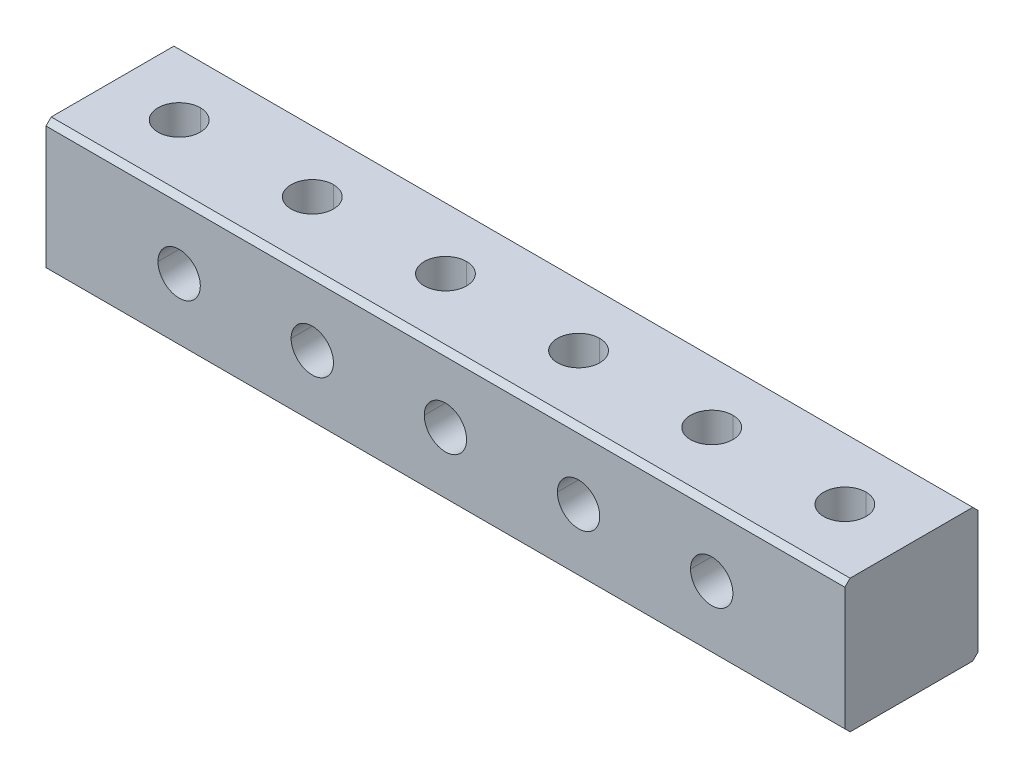
ISO-10303-21;
HEADER;
FILE_DESCRIPTION(('STEP AP214'),'2;1');
FILE_NAME('part.step','',(''),(''),'','','');
FILE_SCHEMA(('AUTOMOTIVE_DESIGN { 1 0 10303 214 1 1 1 1 }'));
ENDSEC;
DATA;
#1=APPLICATION_CONTEXT('core data for automotive mechanical design processes');
#2=APPLICATION_PROTOCOL_DEFINITION('international standard','automotive_design',2000,#1);
#3=PRODUCT_CONTEXT('',#1,'mechanical');
#4=PRODUCT('Part','Part','',(#3));
#5=PRODUCT_RELATED_PRODUCT_CATEGORY('part','',(#4));
#6=PRODUCT_DEFINITION_FORMATION('','',#4);
#7=PRODUCT_DEFINITION_CONTEXT('part definition',#1,'design');
#8=PRODUCT_DEFINITION('design','',#6,#7);
#9=PRODUCT_DEFINITION_SHAPE('','',#8);
#10=(LENGTH_UNIT() NAMED_UNIT(*) SI_UNIT(.MILLI.,.METRE.));
#11=(NAMED_UNIT(*) PLANE_ANGLE_UNIT() SI_UNIT($,.RADIAN.));
#12=(NAMED_UNIT(*) SI_UNIT($,.STERADIAN.) SOLID_ANGLE_UNIT());
#13=UNCERTAINTY_MEASURE_WITH_UNIT(LENGTH_MEASURE(1.E-05),#10,'distance_accuracy_value','');
#14=(GEOMETRIC_REPRESENTATION_CONTEXT(3) GLOBAL_UNCERTAINTY_ASSIGNED_CONTEXT((#13)) GLOBAL_UNIT_ASSIGNED_CONTEXT((#10,
#11,#12)) REPRESENTATION_CONTEXT('',''));
#15=CARTESIAN_POINT('',(0.,0.,0.));
#16=DIRECTION('',(0.,0.,1.));
#17=DIRECTION('',(1.,0.,0.));
#18=AXIS2_PLACEMENT_3D('',#15,#16,#17);
#19=CARTESIAN_POINT('',(38.1,5.85,6.35));
#20=DIRECTION('',(0.,-0.707106781186548,-0.707106781186548));
#21=DIRECTION('',(0.,-0.707106781186548,0.707106781186548));
#22=AXIS2_PLACEMENT_3D('',#19,#20,#21);
#23=PLANE('',#22);
#24=DIRECTION('',(0.,-0.707106781186548,0.707106781186548));
#25=VECTOR('',#24,1.);
#26=CARTESIAN_POINT('',(38.1,6.1,6.1));
#27=LINE('',#26,#25);
#28=CARTESIAN_POINT('',(38.1,6.35,5.85));
#29=VERTEX_POINT('',#28);
#30=CARTESIAN_POINT('',(38.1,5.85,6.35));
#31=VERTEX_POINT('',#30);
#32=EDGE_CURVE('E546',#29,#31,#27,.T.);
#33=ORIENTED_EDGE('',*,*,#32,.F.);
#34=DIRECTION('',(1.,0.,0.));
#35=VECTOR('',#34,1.);
#36=CARTESIAN_POINT('',(38.1,6.35,5.85));
#37=LINE('',#36,#35);
#38=CARTESIAN_POINT('',(-38.1,6.35,5.85));
#39=VERTEX_POINT('',#38);
#40=EDGE_CURVE('E341',#39,#29,#37,.T.);
#41=ORIENTED_EDGE('',*,*,#40,.F.);
#42=DIRECTION('',(0.,0.707106781186548,-0.707106781186548));
#43=VECTOR('',#42,1.);
#44=CARTESIAN_POINT('',(-38.1,5.85,6.35));
#45=LINE('',#44,#43);
#46=CARTESIAN_POINT('',(-38.1,5.85,6.35));
#47=VERTEX_POINT('',#46);
#48=EDGE_CURVE('E20',#47,#39,#45,.T.);
#49=ORIENTED_EDGE('',*,*,#48,.F.);
#50=DIRECTION('',(-1.,0.,0.));
#51=VECTOR('',#50,1.);
#52=CARTESIAN_POINT('',(38.1,5.85,6.35));
#53=LINE('',#52,#51);
#54=EDGE_CURVE('E405',#31,#47,#53,.T.);
#55=ORIENTED_EDGE('',*,*,#54,.F.);
#56=EDGE_LOOP('',(#33,#41,#49,#55));
#57=FACE_BOUND('',#56,.T.);
#58=ADVANCED_FACE('F17',(#57),#23,.F.);
#59=CARTESIAN_POINT('',(38.1,6.35,-5.85));
#60=DIRECTION('',(0.,-0.707106781186548,0.707106781186548));
#61=DIRECTION('',(-1.,0.,0.));
#62=AXIS2_PLACEMENT_3D('',#59,#60,#61);
#63=PLANE('',#62);
#64=DIRECTION('',(0.,0.707106781186548,0.707106781186548));
#65=VECTOR('',#64,1.);
#66=CARTESIAN_POINT('',(38.1,6.1,-6.1));
#67=LINE('',#66,#65);
#68=CARTESIAN_POINT('',(38.1,5.85,-6.35));
#69=VERTEX_POINT('',#68);
#70=CARTESIAN_POINT('',(38.1,6.35,-5.85));
#71=VERTEX_POINT('',#70);
#72=EDGE_CURVE('E470',#69,#71,#67,.T.);
#73=ORIENTED_EDGE('',*,*,#72,.F.);
#74=DIRECTION('',(1.,0.,0.));
#75=VECTOR('',#74,1.);
#76=CARTESIAN_POINT('',(38.1,5.85,-6.35));
#77=LINE('',#76,#75);
#78=CARTESIAN_POINT('',(-38.1,5.85,-6.35));
#79=VERTEX_POINT('',#78);
#80=EDGE_CURVE('E382',#79,#69,#77,.T.);
#81=ORIENTED_EDGE('',*,*,#80,.F.);
#82=DIRECTION('',(0.,-0.707106781186548,-0.707106781186548));
#83=VECTOR('',#82,1.);
#84=CARTESIAN_POINT('',(-38.1,6.35,-5.85));
#85=LINE('',#84,#83);
#86=CARTESIAN_POINT('',(-38.1,6.35,-5.85));
#87=VERTEX_POINT('',#86);
#88=EDGE_CURVE('E11',#87,#79,#85,.T.);
#89=ORIENTED_EDGE('',*,*,#88,.F.);
#90=DIRECTION('',(-1.,0.,0.));
#91=VECTOR('',#90,1.);
#92=CARTESIAN_POINT('',(38.1,6.35,-5.85));
#93=LINE('',#92,#91);
#94=EDGE_CURVE('E505',#71,#87,#93,.T.);
#95=ORIENTED_EDGE('',*,*,#94,.F.);
#96=EDGE_LOOP('',(#73,#81,#89,#95));
#97=FACE_BOUND('',#96,.T.);
#98=ADVANCED_FACE('F567',(#97),#63,.F.);
#99=CARTESIAN_POINT('',(38.1,-6.35,5.85));
#100=DIRECTION('',(0.,0.707106781186548,-0.707106781186548));
#101=DIRECTION('',(-1.,0.,0.));
#102=AXIS2_PLACEMENT_3D('',#99,#100,#101);
#103=PLANE('',#102);
#104=DIRECTION('',(0.,-0.707106781186548,-0.707106781186548));
#105=VECTOR('',#104,1.);
#106=CARTESIAN_POINT('',(38.1,-6.1,6.1));
#107=LINE('',#106,#105);
#108=CARTESIAN_POINT('',(38.1,-5.85,6.35));
#109=VERTEX_POINT('',#108);
#110=CARTESIAN_POINT('',(38.1,-6.35,5.85));
#111=VERTEX_POINT('',#110);
#112=EDGE_CURVE('E40',#109,#111,#107,.T.);
#113=ORIENTED_EDGE('',*,*,#112,.F.);
#114=DIRECTION('',(1.,0.,0.));
#115=VECTOR('',#114,1.);
#116=CARTESIAN_POINT('',(38.1,-5.85,6.35));
#117=LINE('',#116,#115);
#118=CARTESIAN_POINT('',(-38.1,-5.85,6.35));
#119=VERTEX_POINT('',#118);
#120=EDGE_CURVE('E374',#119,#109,#117,.T.);
#121=ORIENTED_EDGE('',*,*,#120,.F.);
#122=DIRECTION('',(0.,0.707106781186548,0.707106781186548));
#123=VECTOR('',#122,1.);
#124=CARTESIAN_POINT('',(-38.1,-6.35,5.85));
#125=LINE('',#124,#123);
#126=CARTESIAN_POINT('',(-38.1,-6.35,5.85));
#127=VERTEX_POINT('',#126);
#128=EDGE_CURVE('E237',#127,#119,#125,.T.);
#129=ORIENTED_EDGE('',*,*,#128,.F.);
#130=DIRECTION('',(-1.,0.,0.));
#131=VECTOR('',#130,1.);
#132=CARTESIAN_POINT('',(38.1,-6.35,5.85));
#133=LINE('',#132,#131);
#134=EDGE_CURVE('E250',#111,#127,#133,.T.);
#135=ORIENTED_EDGE('',*,*,#134,.F.);
#136=EDGE_LOOP('',(#113,#121,#129,#135));
#137=FACE_BOUND('',#136,.T.);
#138=ADVANCED_FACE('F577',(#137),#103,.F.);
#139=CARTESIAN_POINT('',(38.1,-5.85,-6.35));
#140=DIRECTION('',(0.,0.707106781186548,0.707106781186548));
#141=DIRECTION('',(1.,0.,0.));
#142=AXIS2_PLACEMENT_3D('',#139,#140,#141);
#143=PLANE('',#142);
#144=DIRECTION('',(0.,0.707106781186548,-0.707106781186548));
#145=VECTOR('',#144,1.);
#146=CARTESIAN_POINT('',(38.1,-6.1,-6.1));
#147=LINE('',#146,#145);
#148=CARTESIAN_POINT('',(38.1,-6.35,-5.85));
#149=VERTEX_POINT('',#148);
#150=CARTESIAN_POINT('',(38.1,-5.85,-6.35));
#151=VERTEX_POINT('',#150);
#152=EDGE_CURVE('E242',#149,#151,#147,.T.);
#153=ORIENTED_EDGE('',*,*,#152,.F.);
#154=DIRECTION('',(1.,0.,0.));
#155=VECTOR('',#154,1.);
#156=CARTESIAN_POINT('',(38.1,-6.35,-5.85));
#157=LINE('',#156,#155);
#158=CARTESIAN_POINT('',(-38.1,-6.35,-5.85));
#159=VERTEX_POINT('',#158);
#160=EDGE_CURVE('E240',#159,#149,#157,.T.);
#161=ORIENTED_EDGE('',*,*,#160,.F.);
#162=DIRECTION('',(0.,-0.707106781186548,0.707106781186548));
#163=VECTOR('',#162,1.);
#164=CARTESIAN_POINT('',(-38.1,-5.85,-6.35));
#165=LINE('',#164,#163);
#166=CARTESIAN_POINT('',(-38.1,-5.85,-6.35));
#167=VERTEX_POINT('',#166);
#168=EDGE_CURVE('E226',#167,#159,#165,.T.);
#169=ORIENTED_EDGE('',*,*,#168,.F.);
#170=DIRECTION('',(-1.,0.,0.));
#171=VECTOR('',#170,1.);
#172=CARTESIAN_POINT('',(38.1,-5.85,-6.35));
#173=LINE('',#172,#171);
#174=EDGE_CURVE('E487',#151,#167,#173,.T.);
#175=ORIENTED_EDGE('',*,*,#174,.F.);
#176=EDGE_LOOP('',(#153,#161,#169,#175));
#177=FACE_BOUND('',#176,.T.);
#178=ADVANCED_FACE('F241',(#177),#143,.F.);
#179=CARTESIAN_POINT('',(-31.75,6.35,0.));
#180=DIRECTION('',(0.,1.,0.));
#181=DIRECTION('',(0.,0.,1.));
#182=AXIS2_PLACEMENT_3D('',#179,#180,#181);
#183=CYLINDRICAL_SURFACE('',#182,2.0193);
#184=DIRECTION('',(0.,1.,0.));
#185=VECTOR('',#184,1.);
#186=CARTESIAN_POINT('',(-31.75,6.35,-2.0193));
#187=LINE('',#186,#185);
#188=CARTESIAN_POINT('',(-31.75,-6.35,-2.0193));
#189=VERTEX_POINT('',#188);
#190=CARTESIAN_POINT('',(-31.75,6.35,-2.0193));
#191=VERTEX_POINT('',#190);
#192=EDGE_CURVE('E262',#189,#191,#187,.T.);
#193=ORIENTED_EDGE('',*,*,#192,.F.);
#194=CARTESIAN_POINT('',(-31.75,-6.35,0.));
#195=DIRECTION('',(0.,1.,0.));
#196=DIRECTION('',(0.,0.,1.));
#197=AXIS2_PLACEMENT_3D('',#194,#195,#196);
#198=CIRCLE('',#197,2.0193);
#199=CARTESIAN_POINT('',(-31.75,-6.35,2.0193));
#200=VERTEX_POINT('',#199);
#201=EDGE_CURVE('E332',#200,#189,#198,.T.);
#202=ORIENTED_EDGE('',*,*,#201,.F.);
#203=DIRECTION('',(0.,1.,0.));
#204=VECTOR('',#203,1.);
#205=CARTESIAN_POINT('',(-31.75,6.35,2.0193));
#206=LINE('',#205,#204);
#207=CARTESIAN_POINT('',(-31.75,6.35,2.0193));
#208=VERTEX_POINT('',#207);
#209=EDGE_CURVE('E264',#200,#208,#206,.T.);
#210=ORIENTED_EDGE('',*,*,#209,.T.);
#211=CARTESIAN_POINT('',(-31.75,6.35,0.));
#212=DIRECTION('',(0.,1.,0.));
#213=DIRECTION('',(0.,0.,1.));
#214=AXIS2_PLACEMENT_3D('',#211,#212,#213);
#215=CIRCLE('',#214,2.0193);
#216=EDGE_CURVE('E336',#208,#191,#215,.T.);
#217=ORIENTED_EDGE('',*,*,#216,.T.);
#218=EDGE_LOOP('',(#193,#202,#210,#217));
#219=FACE_BOUND('',#218,.T.);
#220=ADVANCED_FACE('F586',(#219),#183,.F.);
#221=CARTESIAN_POINT('',(-19.05,6.35,0.));
#222=DIRECTION('',(0.,1.,0.));
#223=DIRECTION('',(0.,0.,1.));
#224=AXIS2_PLACEMENT_3D('',#221,#222,#223);
#225=CYLINDRICAL_SURFACE('',#224,2.0193);
#226=DIRECTION('',(0.,1.,0.));
#227=VECTOR('',#226,1.);
#228=CARTESIAN_POINT('',(-19.05,6.35,-2.0193));
#229=LINE('',#228,#227);
#230=CARTESIAN_POINT('',(-19.05,-6.35,-2.0193));
#231=VERTEX_POINT('',#230);
#232=CARTESIAN_POINT('',(-19.05,6.35,-2.0193));
#233=VERTEX_POINT('',#232);
#234=EDGE_CURVE('E276',#231,#233,#229,.T.);
#235=ORIENTED_EDGE('',*,*,#234,.F.);
#236=CARTESIAN_POINT('',(-19.05,-6.35,0.));
#237=DIRECTION('',(0.,1.,0.));
#238=DIRECTION('',(0.,0.,1.));
#239=AXIS2_PLACEMENT_3D('',#236,#237,#238);
#240=CIRCLE('',#239,2.0193);
#241=CARTESIAN_POINT('',(-19.05,-6.35,2.0193));
#242=VERTEX_POINT('',#241);
#243=EDGE_CURVE('E327',#242,#231,#240,.T.);
#244=ORIENTED_EDGE('',*,*,#243,.F.);
#245=DIRECTION('',(0.,1.,0.));
#246=VECTOR('',#245,1.);
#247=CARTESIAN_POINT('',(-19.05,6.35,2.0193));
#248=LINE('',#247,#246);
#249=CARTESIAN_POINT('',(-19.05,6.35,2.0193));
#250=VERTEX_POINT('',#249);
#251=EDGE_CURVE('E301',#242,#250,#248,.T.);
#252=ORIENTED_EDGE('',*,*,#251,.T.);
#253=CARTESIAN_POINT('',(-19.05,6.35,0.));
#254=DIRECTION('',(0.,1.,0.));
#255=DIRECTION('',(0.,0.,1.));
#256=AXIS2_PLACEMENT_3D('',#253,#254,#255);
#257=CIRCLE('',#256,2.0193);
#258=EDGE_CURVE('E340',#250,#233,#257,.T.);
#259=ORIENTED_EDGE('',*,*,#258,.T.);
#260=EDGE_LOOP('',(#235,#244,#252,#259));
#261=FACE_BOUND('',#260,.T.);
#262=ADVANCED_FACE('F631',(#261),#225,.F.);
#263=CARTESIAN_POINT('',(31.75,6.35,0.));
#264=DIRECTION('',(0.,1.,0.));
#265=DIRECTION('',(0.,0.,1.));
#266=AXIS2_PLACEMENT_3D('',#263,#264,#265);
#267=CYLINDRICAL_SURFACE('',#266,2.0193);
#268=DIRECTION('',(0.,1.,0.));
#269=VECTOR('',#268,1.);
#270=CARTESIAN_POINT('',(31.75,6.35,-2.0193));
#271=LINE('',#270,#269);
#272=CARTESIAN_POINT('',(31.75,-6.35,-2.0193));
#273=VERTEX_POINT('',#272);
#274=CARTESIAN_POINT('',(31.75,6.35,-2.0193));
#275=VERTEX_POINT('',#274);
#276=EDGE_CURVE('E292',#273,#275,#271,.T.);
#277=ORIENTED_EDGE('',*,*,#276,.F.);
#278=CARTESIAN_POINT('',(31.75,-6.35,0.));
#279=DIRECTION('',(0.,1.,0.));
#280=DIRECTION('',(0.,0.,1.));
#281=AXIS2_PLACEMENT_3D('',#278,#279,#280);
#282=CIRCLE('',#281,2.0193);
#283=CARTESIAN_POINT('',(31.75,-6.35,2.0193));
#284=VERTEX_POINT('',#283);
#285=EDGE_CURVE('E331',#284,#273,#282,.T.);
#286=ORIENTED_EDGE('',*,*,#285,.F.);
#287=DIRECTION('',(0.,1.,0.));
#288=VECTOR('',#287,1.);
#289=CARTESIAN_POINT('',(31.75,6.35,2.0193));
#290=LINE('',#289,#288);
#291=CARTESIAN_POINT('',(31.75,6.35,2.0193));
#292=VERTEX_POINT('',#291);
#293=EDGE_CURVE('E319',#284,#292,#290,.T.);
#294=ORIENTED_EDGE('',*,*,#293,.T.);
#295=CARTESIAN_POINT('',(31.75,6.35,0.));
#296=DIRECTION('',(0.,1.,0.));
#297=DIRECTION('',(0.,0.,1.));
#298=AXIS2_PLACEMENT_3D('',#295,#296,#297);
#299=CIRCLE('',#298,2.0193);
#300=EDGE_CURVE('E483',#292,#275,#299,.T.);
#301=ORIENTED_EDGE('',*,*,#300,.T.);
#302=EDGE_LOOP('',(#277,#286,#294,#301));
#303=FACE_BOUND('',#302,.T.);
#304=ADVANCED_FACE('F641',(#303),#267,.F.);
#305=CARTESIAN_POINT('',(19.05,6.35,0.));
#306=DIRECTION('',(0.,1.,0.));
#307=DIRECTION('',(0.,0.,1.));
#308=AXIS2_PLACEMENT_3D('',#305,#306,#307);
#309=CYLINDRICAL_SURFACE('',#308,2.0193);
#310=DIRECTION('',(0.,1.,0.));
#311=VECTOR('',#310,1.);
#312=CARTESIAN_POINT('',(19.05,6.35,-2.0193));
#313=LINE('',#312,#311);
#314=CARTESIAN_POINT('',(19.05,-6.35,-2.0193));
#315=VERTEX_POINT('',#314);
#316=CARTESIAN_POINT('',(19.05,6.35,-2.0193));
#317=VERTEX_POINT('',#316);
#318=EDGE_CURVE('E315',#315,#317,#313,.T.);
#319=ORIENTED_EDGE('',*,*,#318,.F.);
#320=CARTESIAN_POINT('',(19.05,-6.35,0.));
#321=DIRECTION('',(0.,1.,0.));
#322=DIRECTION('',(0.,0.,1.));
#323=AXIS2_PLACEMENT_3D('',#320,#321,#322);
#324=CIRCLE('',#323,2.0193);
#325=CARTESIAN_POINT('',(19.05,-6.35,2.0193));
#326=VERTEX_POINT('',#325);
#327=EDGE_CURVE('E441',#326,#315,#324,.T.);
#328=ORIENTED_EDGE('',*,*,#327,.F.);
#329=DIRECTION('',(0.,1.,0.));
#330=VECTOR('',#329,1.);
#331=CARTESIAN_POINT('',(19.05,6.35,2.0193));
#332=LINE('',#331,#330);
#333=CARTESIAN_POINT('',(19.05,6.35,2.0193));
#334=VERTEX_POINT('',#333);
#335=EDGE_CURVE('E314',#326,#334,#332,.T.);
#336=ORIENTED_EDGE('',*,*,#335,.T.);
#337=CARTESIAN_POINT('',(19.05,6.35,0.));
#338=DIRECTION('',(0.,1.,0.));
#339=DIRECTION('',(0.,0.,1.));
#340=AXIS2_PLACEMENT_3D('',#337,#338,#339);
#341=CIRCLE('',#340,2.0193);
#342=EDGE_CURVE('E514',#334,#317,#341,.T.);
#343=ORIENTED_EDGE('',*,*,#342,.T.);
#344=EDGE_LOOP('',(#319,#328,#336,#343));
#345=FACE_BOUND('',#344,.T.);
#346=ADVANCED_FACE('F652',(#345),#309,.F.);
#347=CARTESIAN_POINT('',(6.35,6.35,0.));
#348=DIRECTION('',(0.,1.,0.));
#349=DIRECTION('',(0.,0.,1.));
#350=AXIS2_PLACEMENT_3D('',#347,#348,#349);
#351=CYLINDRICAL_SURFACE('',#350,2.0193);
#352=DIRECTION('',(0.,1.,0.));
#353=VECTOR('',#352,1.);
#354=CARTESIAN_POINT('',(6.35,6.35,-2.0193));
#355=LINE('',#354,#353);
#356=CARTESIAN_POINT('',(6.35,-6.35,-2.0193));
#357=VERTEX_POINT('',#356);
#358=CARTESIAN_POINT('',(6.35,6.35,-2.0193));
#359=VERTEX_POINT('',#358);
#360=EDGE_CURVE('E357',#357,#359,#355,.T.);
#361=ORIENTED_EDGE('',*,*,#360,.F.);
#362=CARTESIAN_POINT('',(6.35,-6.35,0.));
#363=DIRECTION('',(0.,1.,0.));
#364=DIRECTION('',(0.,0.,1.));
#365=AXIS2_PLACEMENT_3D('',#362,#363,#364);
#366=CIRCLE('',#365,2.0193);
#367=CARTESIAN_POINT('',(6.35,-6.35,2.0193));
#368=VERTEX_POINT('',#367);
#369=EDGE_CURVE('E539',#368,#357,#366,.T.);
#370=ORIENTED_EDGE('',*,*,#369,.F.);
#371=DIRECTION('',(0.,1.,0.));
#372=VECTOR('',#371,1.);
#373=CARTESIAN_POINT('',(6.35,6.35,2.0193));
#374=LINE('',#373,#372);
#375=CARTESIAN_POINT('',(6.35,6.35,2.0193));
#376=VERTEX_POINT('',#375);
#377=EDGE_CURVE('E365',#368,#376,#374,.T.);
#378=ORIENTED_EDGE('',*,*,#377,.T.);
#379=CARTESIAN_POINT('',(6.35,6.35,0.));
#380=DIRECTION('',(0.,1.,0.));
#381=DIRECTION('',(0.,0.,1.));
#382=AXIS2_PLACEMENT_3D('',#379,#380,#381);
#383=CIRCLE('',#382,2.0193);
#384=EDGE_CURVE('E518',#376,#359,#383,.T.);
#385=ORIENTED_EDGE('',*,*,#384,.T.);
#386=EDGE_LOOP('',(#361,#370,#378,#385));
#387=FACE_BOUND('',#386,.T.);
#388=ADVANCED_FACE('F663',(#387),#351,.F.);
#389=CARTESIAN_POINT('',(-25.4,0.,6.35));
#390=DIRECTION('',(0.,0.,1.));
#391=DIRECTION('',(1.,0.,0.));
#392=AXIS2_PLACEMENT_3D('',#389,#390,#391);
#393=CYLINDRICAL_SURFACE('',#392,2.0193);
#394=DIRECTION('',(0.,0.,1.));
#395=VECTOR('',#394,1.);
#396=CARTESIAN_POINT('',(-27.4193,0.,6.35));
#397=LINE('',#396,#395);
#398=CARTESIAN_POINT('',(-27.4193,0.,-6.35));
#399=VERTEX_POINT('',#398);
#400=CARTESIAN_POINT('',(-27.4193,0.,6.35));
#401=VERTEX_POINT('',#400);
#402=EDGE_CURVE('E373',#399,#401,#397,.T.);
#403=ORIENTED_EDGE('',*,*,#402,.F.);
#404=CARTESIAN_POINT('',(-25.4,0.,-6.35));
#405=DIRECTION('',(0.,0.,1.));
#406=DIRECTION('',(1.,0.,0.));
#407=AXIS2_PLACEMENT_3D('',#404,#405,#406);
#408=CIRCLE('',#407,2.0193);
#409=CARTESIAN_POINT('',(-23.3807,0.,-6.35));
#410=VERTEX_POINT('',#409);
#411=EDGE_CURVE('E291',#410,#399,#408,.T.);
#412=ORIENTED_EDGE('',*,*,#411,.F.);
#413=DIRECTION('',(0.,0.,1.));
#414=VECTOR('',#413,1.);
#415=CARTESIAN_POINT('',(-23.3807,0.,6.35));
#416=LINE('',#415,#414);
#417=CARTESIAN_POINT('',(-23.3807,0.,6.35));
#418=VERTEX_POINT('',#417);
#419=EDGE_CURVE('E390',#410,#418,#416,.T.);
#420=ORIENTED_EDGE('',*,*,#419,.T.);
#421=CARTESIAN_POINT('',(-25.4,0.,6.35));
#422=DIRECTION('',(0.,0.,1.));
#423=DIRECTION('',(1.,0.,0.));
#424=AXIS2_PLACEMENT_3D('',#421,#422,#423);
#425=CIRCLE('',#424,2.0193);
#426=EDGE_CURVE('E309',#418,#401,#425,.T.);
#427=ORIENTED_EDGE('',*,*,#426,.T.);
#428=EDGE_LOOP('',(#403,#412,#420,#427));
#429=FACE_BOUND('',#428,.T.);
#430=ADVANCED_FACE('F674',(#429),#393,.F.);
#431=CARTESIAN_POINT('',(-12.7,0.,6.35));
#432=DIRECTION('',(0.,0.,1.));
#433=DIRECTION('',(1.,0.,0.));
#434=AXIS2_PLACEMENT_3D('',#431,#432,#433);
#435=CYLINDRICAL_SURFACE('',#434,2.0193);
#436=DIRECTION('',(0.,0.,1.));
#437=VECTOR('',#436,1.);
#438=CARTESIAN_POINT('',(-14.7193,0.,6.35));
#439=LINE('',#438,#437);
#440=CARTESIAN_POINT('',(-14.7193,0.,-6.35));
#441=VERTEX_POINT('',#440);
#442=CARTESIAN_POINT('',(-14.7193,0.,6.35));
#443=VERTEX_POINT('',#442);
#444=EDGE_CURVE('E398',#441,#443,#439,.T.);
#445=ORIENTED_EDGE('',*,*,#444,.F.);
#446=CARTESIAN_POINT('',(-12.7,0.,-6.35));
#447=DIRECTION('',(0.,0.,1.));
#448=DIRECTION('',(1.,0.,0.));
#449=AXIS2_PLACEMENT_3D('',#446,#447,#448);
#450=CIRCLE('',#449,2.0193);
#451=CARTESIAN_POINT('',(-10.6807,0.,-6.35));
#452=VERTEX_POINT('',#451);
#453=EDGE_CURVE('E287',#452,#441,#450,.T.);
#454=ORIENTED_EDGE('',*,*,#453,.F.);
#455=DIRECTION('',(0.,0.,1.));
#456=VECTOR('',#455,1.);
#457=CARTESIAN_POINT('',(-10.6807,0.,6.35));
#458=LINE('',#457,#456);
#459=CARTESIAN_POINT('',(-10.6807,0.,6.35));
#460=VERTEX_POINT('',#459);
#461=EDGE_CURVE('E409',#452,#460,#458,.T.);
#462=ORIENTED_EDGE('',*,*,#461,.T.);
#463=CARTESIAN_POINT('',(-12.7,0.,6.35));
#464=DIRECTION('',(0.,0.,1.));
#465=DIRECTION('',(1.,0.,0.));
#466=AXIS2_PLACEMENT_3D('',#463,#464,#465);
#467=CIRCLE('',#466,2.0193);
#468=EDGE_CURVE('E305',#460,#443,#467,.T.);
#469=ORIENTED_EDGE('',*,*,#468,.T.);
#470=EDGE_LOOP('',(#445,#454,#462,#469));
#471=FACE_BOUND('',#470,.T.);
#472=ADVANCED_FACE('F682',(#471),#435,.F.);
#473=CARTESIAN_POINT('',(25.4,0.,6.35));
#474=DIRECTION('',(0.,0.,1.));
#475=DIRECTION('',(1.,0.,0.));
#476=AXIS2_PLACEMENT_3D('',#473,#474,#475);
#477=CYLINDRICAL_SURFACE('',#476,2.0193);
#478=DIRECTION('',(0.,0.,1.));
#479=VECTOR('',#478,1.);
#480=CARTESIAN_POINT('',(23.3807,0.,6.35));
#481=LINE('',#480,#479);
#482=CARTESIAN_POINT('',(23.3807,0.,-6.35));
#483=VERTEX_POINT('',#482);
#484=CARTESIAN_POINT('',(23.3807,0.,6.35));
#485=VERTEX_POINT('',#484);
#486=EDGE_CURVE('E417',#483,#485,#481,.T.);
#487=ORIENTED_EDGE('',*,*,#486,.F.);
#488=CARTESIAN_POINT('',(25.4,0.,-6.35));
#489=DIRECTION('',(0.,0.,1.));
#490=DIRECTION('',(1.,0.,0.));
#491=AXIS2_PLACEMENT_3D('',#488,#489,#490);
#492=CIRCLE('',#491,2.0193);
#493=CARTESIAN_POINT('',(27.4193,0.,-6.35));
#494=VERTEX_POINT('',#493);
#495=EDGE_CURVE('E290',#494,#483,#492,.T.);
#496=ORIENTED_EDGE('',*,*,#495,.F.);
#497=DIRECTION('',(0.,0.,1.));
#498=VECTOR('',#497,1.);
#499=CARTESIAN_POINT('',(27.4193,0.,6.35));
#500=LINE('',#499,#498);
#501=CARTESIAN_POINT('',(27.4193,0.,6.35));
#502=VERTEX_POINT('',#501);
#503=EDGE_CURVE('E345',#494,#502,#500,.T.);
#504=ORIENTED_EDGE('',*,*,#503,.T.);
#505=CARTESIAN_POINT('',(25.4,0.,6.35));
#506=DIRECTION('',(0.,0.,1.));
#507=DIRECTION('',(1.,0.,0.));
#508=AXIS2_PLACEMENT_3D('',#505,#506,#507);
#509=CIRCLE('',#508,2.0193);
#510=EDGE_CURVE('E308',#502,#485,#509,.T.);
#511=ORIENTED_EDGE('',*,*,#510,.T.);
#512=EDGE_LOOP('',(#487,#496,#504,#511));
#513=FACE_BOUND('',#512,.T.);
#514=ADVANCED_FACE('F687',(#513),#477,.F.);
#515=CARTESIAN_POINT('',(12.7,0.,6.35));
#516=DIRECTION('',(0.,0.,1.));
#517=DIRECTION('',(1.,0.,0.));
#518=AXIS2_PLACEMENT_3D('',#515,#516,#517);
#519=CYLINDRICAL_SURFACE('',#518,2.0193);
#520=DIRECTION('',(0.,0.,1.));
#521=VECTOR('',#520,1.);
#522=CARTESIAN_POINT('',(10.6807,0.,6.35));
#523=LINE('',#522,#521);
#524=CARTESIAN_POINT('',(10.6807,0.,-6.35));
#525=VERTEX_POINT('',#524);
#526=CARTESIAN_POINT('',(10.6807,0.,6.35));
#527=VERTEX_POINT('',#526);
#528=EDGE_CURVE('E277',#525,#527,#523,.T.);
#529=ORIENTED_EDGE('',*,*,#528,.F.);
#530=CARTESIAN_POINT('',(12.7,0.,-6.35));
#531=DIRECTION('',(0.,0.,1.));
#532=DIRECTION('',(1.,0.,0.));
#533=AXIS2_PLACEMENT_3D('',#530,#531,#532);
#534=CIRCLE('',#533,2.0193);
#535=CARTESIAN_POINT('',(14.7193,0.,-6.35));
#536=VERTEX_POINT('',#535);
#537=EDGE_CURVE('E496',#536,#525,#534,.T.);
#538=ORIENTED_EDGE('',*,*,#537,.F.);
#539=DIRECTION('',(0.,0.,1.));
#540=VECTOR('',#539,1.);
#541=CARTESIAN_POINT('',(14.7193,0.,6.35));
#542=LINE('',#541,#540);
#543=CARTESIAN_POINT('',(14.7193,0.,6.35));
#544=VERTEX_POINT('',#543);
#545=EDGE_CURVE('E353',#536,#544,#542,.T.);
#546=ORIENTED_EDGE('',*,*,#545,.T.);
#547=CARTESIAN_POINT('',(12.7,0.,6.35));
#548=DIRECTION('',(0.,0.,1.));
#549=DIRECTION('',(1.,0.,0.));
#550=AXIS2_PLACEMENT_3D('',#547,#548,#549);
#551=CIRCLE('',#550,2.0193);
#552=EDGE_CURVE('E258',#544,#527,#551,.T.);
#553=ORIENTED_EDGE('',*,*,#552,.T.);
#554=EDGE_LOOP('',(#529,#538,#546,#553));
#555=FACE_BOUND('',#554,.T.);
#556=ADVANCED_FACE('F698',(#555),#519,.F.);
#557=CARTESIAN_POINT('',(-6.35,6.35,0.));
#558=DIRECTION('',(0.,1.,0.));
#559=DIRECTION('',(0.,0.,1.));
#560=AXIS2_PLACEMENT_3D('',#557,#558,#559);
#561=CYLINDRICAL_SURFACE('',#560,2.0193);
#562=DIRECTION('',(0.,1.,0.));
#563=VECTOR('',#562,1.);
#564=CARTESIAN_POINT('',(-6.35,6.35,-2.0193));
#565=LINE('',#564,#563);
#566=CARTESIAN_POINT('',(-6.35,-6.35,-2.0193));
#567=VERTEX_POINT('',#566);
#568=CARTESIAN_POINT('',(-6.35,6.35,-2.0193));
#569=VERTEX_POINT('',#568);
#570=EDGE_CURVE('E447',#567,#569,#565,.T.);
#571=ORIENTED_EDGE('',*,*,#570,.F.);
#572=CARTESIAN_POINT('',(-6.35,-6.35,0.));
#573=DIRECTION('',(0.,1.,0.));
#574=DIRECTION('',(0.,0.,1.));
#575=AXIS2_PLACEMENT_3D('',#572,#573,#574);
#576=CIRCLE('',#575,2.0193);
#577=CARTESIAN_POINT('',(-6.35,-6.35,2.0193));
#578=VERTEX_POINT('',#577);
#579=EDGE_CURVE('E471',#578,#567,#576,.T.);
#580=ORIENTED_EDGE('',*,*,#579,.F.);
#581=DIRECTION('',(0.,1.,0.));
#582=VECTOR('',#581,1.);
#583=CARTESIAN_POINT('',(-6.35,6.35,2.0193));
#584=LINE('',#583,#582);
#585=CARTESIAN_POINT('',(-6.35,6.35,2.0193));
#586=VERTEX_POINT('',#585);
#587=EDGE_CURVE('E455',#578,#586,#584,.T.);
#588=ORIENTED_EDGE('',*,*,#587,.T.);
#589=CARTESIAN_POINT('',(-6.35,6.35,0.));
#590=DIRECTION('',(0.,1.,0.));
#591=DIRECTION('',(0.,0.,1.));
#592=AXIS2_PLACEMENT_3D('',#589,#590,#591);
#593=CIRCLE('',#592,2.0193);
#594=EDGE_CURVE('E521',#586,#569,#593,.T.);
#595=ORIENTED_EDGE('',*,*,#594,.T.);
#596=EDGE_LOOP('',(#571,#580,#588,#595));
#597=FACE_BOUND('',#596,.T.);
#598=ADVANCED_FACE('F709',(#597),#561,.F.);
#599=CARTESIAN_POINT('',(0.,0.,6.35));
#600=DIRECTION('',(0.,0.,1.));
#601=DIRECTION('',(1.,0.,0.));
#602=AXIS2_PLACEMENT_3D('',#599,#600,#601);
#603=CYLINDRICAL_SURFACE('',#602,2.0193);
#604=DIRECTION('',(0.,0.,1.));
#605=VECTOR('',#604,1.);
#606=CARTESIAN_POINT('',(-2.0193,0.,6.35));
#607=LINE('',#606,#605);
#608=CARTESIAN_POINT('',(-2.0193,0.,-6.35));
#609=VERTEX_POINT('',#608);
#610=CARTESIAN_POINT('',(-2.0193,0.,6.35));
#611=VERTEX_POINT('',#610);
#612=EDGE_CURVE('E463',#609,#611,#607,.T.);
#613=ORIENTED_EDGE('',*,*,#612,.F.);
#614=CARTESIAN_POINT('',(0.,0.,-6.35));
#615=DIRECTION('',(0.,0.,1.));
#616=DIRECTION('',(1.,0.,0.));
#617=AXIS2_PLACEMENT_3D('',#614,#615,#616);
#618=CIRCLE('',#617,2.0193);
#619=CARTESIAN_POINT('',(2.0193,0.,-6.35));
#620=VERTEX_POINT('',#619);
#621=EDGE_CURVE('E492',#620,#609,#618,.T.);
#622=ORIENTED_EDGE('',*,*,#621,.F.);
#623=DIRECTION('',(0.,0.,1.));
#624=VECTOR('',#623,1.);
#625=CARTESIAN_POINT('',(2.0193,0.,6.35));
#626=LINE('',#625,#624);
#627=CARTESIAN_POINT('',(2.0193,0.,6.35));
#628=VERTEX_POINT('',#627);
#629=EDGE_CURVE('E475',#620,#628,#626,.T.);
#630=ORIENTED_EDGE('',*,*,#629,.T.);
#631=CARTESIAN_POINT('',(0.,0.,6.35));
#632=DIRECTION('',(0.,0.,1.));
#633=DIRECTION('',(1.,0.,0.));
#634=AXIS2_PLACEMENT_3D('',#631,#632,#633);
#635=CIRCLE('',#634,2.0193);
#636=EDGE_CURVE('E252',#628,#611,#635,.T.);
#637=ORIENTED_EDGE('',*,*,#636,.T.);
#638=EDGE_LOOP('',(#613,#622,#630,#637));
#639=FACE_BOUND('',#638,.T.);
#640=ADVANCED_FACE('F720',(#639),#603,.F.);
#641=CARTESIAN_POINT('',(-38.1,0.,0.));
#642=DIRECTION('',(1.,0.,0.));
#643=DIRECTION('',(0.,1.,0.));
#644=AXIS2_PLACEMENT_3D('',#641,#642,#643);
#645=PLANE('',#644);
#646=DIRECTION('',(0.,1.,0.));
#647=VECTOR('',#646,1.);
#648=CARTESIAN_POINT('',(-38.1,6.35,-6.35));
#649=LINE('',#648,#647);
#650=EDGE_CURVE('E232',#167,#79,#649,.T.);
#651=ORIENTED_EDGE('',*,*,#650,.F.);
#652=ORIENTED_EDGE('',*,*,#168,.T.);
#653=DIRECTION('',(0.,0.,-1.));
#654=VECTOR('',#653,1.);
#655=CARTESIAN_POINT('',(-38.1,-6.35,6.35));
#656=LINE('',#655,#654);
#657=EDGE_CURVE('E230',#127,#159,#656,.T.);
#658=ORIENTED_EDGE('',*,*,#657,.F.);
#659=ORIENTED_EDGE('',*,*,#128,.T.);
#660=DIRECTION('',(0.,-1.,0.));
#661=VECTOR('',#660,1.);
#662=CARTESIAN_POINT('',(-38.1,6.35,6.35));
#663=LINE('',#662,#661);
#664=EDGE_CURVE('E379',#47,#119,#663,.T.);
#665=ORIENTED_EDGE('',*,*,#664,.F.);
#666=ORIENTED_EDGE('',*,*,#48,.T.);
#667=DIRECTION('',(0.,0.,1.));
#668=VECTOR('',#667,1.);
#669=CARTESIAN_POINT('',(-38.1,6.35,6.35));
#670=LINE('',#669,#668);
#671=EDGE_CURVE('E427',#87,#39,#670,.T.);
#672=ORIENTED_EDGE('',*,*,#671,.F.);
#673=ORIENTED_EDGE('',*,*,#88,.T.);
#674=EDGE_LOOP('',(#651,#652,#658,#659,#665,#666,#672,#673));
#675=FACE_BOUND('',#674,.T.);
#676=ADVANCED_FACE('F228',(#675),#645,.F.);
#677=CARTESIAN_POINT('',(38.1,0.,0.));
#678=DIRECTION('',(1.,0.,0.));
#679=DIRECTION('',(0.,1.,0.));
#680=AXIS2_PLACEMENT_3D('',#677,#678,#679);
#681=PLANE('',#680);
#682=DIRECTION('',(0.,0.,-1.));
#683=VECTOR('',#682,1.);
#684=CARTESIAN_POINT('',(38.1,-6.35,6.35));
#685=LINE('',#684,#683);
#686=EDGE_CURVE('E246',#111,#149,#685,.T.);
#687=ORIENTED_EDGE('',*,*,#686,.T.);
#688=ORIENTED_EDGE('',*,*,#152,.T.);
#689=DIRECTION('',(0.,1.,0.));
#690=VECTOR('',#689,1.);
#691=CARTESIAN_POINT('',(38.1,6.35,-6.35));
#692=LINE('',#691,#690);
#693=EDGE_CURVE('E479',#151,#69,#692,.T.);
#694=ORIENTED_EDGE('',*,*,#693,.T.);
#695=ORIENTED_EDGE('',*,*,#72,.T.);
#696=DIRECTION('',(0.,0.,1.));
#697=VECTOR('',#696,1.);
#698=CARTESIAN_POINT('',(38.1,6.35,6.35));
#699=LINE('',#698,#697);
#700=EDGE_CURVE('E495',#71,#29,#699,.T.);
#701=ORIENTED_EDGE('',*,*,#700,.T.);
#702=ORIENTED_EDGE('',*,*,#32,.T.);
#703=DIRECTION('',(0.,-1.,0.));
#704=VECTOR('',#703,1.);
#705=CARTESIAN_POINT('',(38.1,6.35,6.35));
#706=LINE('',#705,#704);
#707=EDGE_CURVE('E378',#31,#109,#706,.T.);
#708=ORIENTED_EDGE('',*,*,#707,.T.);
#709=ORIENTED_EDGE('',*,*,#112,.T.);
#710=EDGE_LOOP('',(#687,#688,#694,#695,#701,#702,#708,#709));
#711=FACE_BOUND('',#710,.T.);
#712=ADVANCED_FACE('F572',(#711),#681,.T.);
#713=CARTESIAN_POINT('',(38.1,-6.35,6.35));
#714=DIRECTION('',(0.,1.,0.));
#715=DIRECTION('',(1.,0.,0.));
#716=AXIS2_PLACEMENT_3D('',#713,#714,#715);
#717=PLANE('',#716);
#718=ORIENTED_EDGE('',*,*,#579,.T.);
#719=CARTESIAN_POINT('',(-6.35,-6.35,0.));
#720=DIRECTION('',(0.,1.,0.));
#721=DIRECTION('',(0.,0.,1.));
#722=AXIS2_PLACEMENT_3D('',#719,#720,#721);
#723=CIRCLE('',#722,2.0193);
#724=EDGE_CURVE('E437',#567,#578,#723,.T.);
#725=ORIENTED_EDGE('',*,*,#724,.T.);
#726=EDGE_LOOP('',(#718,#725));
#727=FACE_BOUND('',#726,.T.);
#728=ORIENTED_EDGE('',*,*,#369,.T.);
#729=CARTESIAN_POINT('',(6.35,-6.35,0.));
#730=DIRECTION('',(0.,1.,0.));
#731=DIRECTION('',(0.,0.,1.));
#732=AXIS2_PLACEMENT_3D('',#729,#730,#731);
#733=CIRCLE('',#732,2.0193);
#734=EDGE_CURVE('E349',#357,#368,#733,.T.);
#735=ORIENTED_EDGE('',*,*,#734,.T.);
#736=EDGE_LOOP('',(#728,#735));
#737=FACE_BOUND('',#736,.T.);
#738=ORIENTED_EDGE('',*,*,#327,.T.);
#739=CARTESIAN_POINT('',(19.05,-6.35,0.));
#740=DIRECTION('',(0.,1.,0.));
#741=DIRECTION('',(0.,0.,1.));
#742=AXIS2_PLACEMENT_3D('',#739,#740,#741);
#743=CIRCLE('',#742,2.0193);
#744=EDGE_CURVE('E323',#315,#326,#743,.T.);
#745=ORIENTED_EDGE('',*,*,#744,.T.);
#746=EDGE_LOOP('',(#738,#745));
#747=FACE_BOUND('',#746,.T.);
#748=ORIENTED_EDGE('',*,*,#285,.T.);
#749=CARTESIAN_POINT('',(31.75,-6.35,0.));
#750=DIRECTION('',(0.,1.,0.));
#751=DIRECTION('',(0.,0.,1.));
#752=AXIS2_PLACEMENT_3D('',#749,#750,#751);
#753=CIRCLE('',#752,2.0193);
#754=EDGE_CURVE('E297',#273,#284,#753,.T.);
#755=ORIENTED_EDGE('',*,*,#754,.T.);
#756=EDGE_LOOP('',(#748,#755));
#757=FACE_BOUND('',#756,.T.);
#758=ORIENTED_EDGE('',*,*,#243,.T.);
#759=CARTESIAN_POINT('',(-19.05,-6.35,0.));
#760=DIRECTION('',(0.,1.,0.));
#761=DIRECTION('',(0.,0.,1.));
#762=AXIS2_PLACEMENT_3D('',#759,#760,#761);
#763=CIRCLE('',#762,2.0193);
#764=EDGE_CURVE('E268',#231,#242,#763,.T.);
#765=ORIENTED_EDGE('',*,*,#764,.T.);
#766=EDGE_LOOP('',(#758,#765));
#767=FACE_BOUND('',#766,.T.);
#768=ORIENTED_EDGE('',*,*,#201,.T.);
#769=CARTESIAN_POINT('',(-31.75,-6.35,0.));
#770=DIRECTION('',(0.,1.,0.));
#771=DIRECTION('',(0.,0.,1.));
#772=AXIS2_PLACEMENT_3D('',#769,#770,#771);
#773=CIRCLE('',#772,2.0193);
#774=EDGE_CURVE('E1382',#189,#200,#773,.T.);
#775=ORIENTED_EDGE('',*,*,#774,.T.);
#776=EDGE_LOOP('',(#768,#775));
#777=FACE_BOUND('',#776,.T.);
#778=ORIENTED_EDGE('',*,*,#657,.T.);
#779=ORIENTED_EDGE('',*,*,#160,.T.);
#780=ORIENTED_EDGE('',*,*,#686,.F.);
#781=ORIENTED_EDGE('',*,*,#134,.T.);
#782=EDGE_LOOP('',(#778,#779,#780,#781));
#783=FACE_BOUND('',#782,.T.);
#784=ADVANCED_FACE('F249',(#727,#737,#747,#757,#767,#777,#783),#717,.F.);
#785=CARTESIAN_POINT('',(38.1,6.35,6.35));
#786=DIRECTION('',(0.,0.,-1.));
#787=DIRECTION('',(-1.,0.,0.));
#788=AXIS2_PLACEMENT_3D('',#785,#786,#787);
#789=PLANE('',#788);
#790=ORIENTED_EDGE('',*,*,#636,.F.);
#791=CARTESIAN_POINT('',(0.,0.,6.35));
#792=DIRECTION('',(0.,0.,1.));
#793=DIRECTION('',(1.,0.,0.));
#794=AXIS2_PLACEMENT_3D('',#791,#792,#793);
#795=CIRCLE('',#794,2.0193);
#796=EDGE_CURVE('E467',#611,#628,#795,.T.);
#797=ORIENTED_EDGE('',*,*,#796,.F.);
#798=EDGE_LOOP('',(#790,#797));
#799=FACE_BOUND('',#798,.T.);
#800=ORIENTED_EDGE('',*,*,#552,.F.);
#801=CARTESIAN_POINT('',(12.7,0.,6.35));
#802=DIRECTION('',(0.,0.,1.));
#803=DIRECTION('',(1.,0.,0.));
#804=AXIS2_PLACEMENT_3D('',#801,#802,#803);
#805=CIRCLE('',#804,2.0193);
#806=EDGE_CURVE('E281',#527,#544,#805,.T.);
#807=ORIENTED_EDGE('',*,*,#806,.F.);
#808=EDGE_LOOP('',(#800,#807));
#809=FACE_BOUND('',#808,.T.);
#810=ORIENTED_EDGE('',*,*,#510,.F.);
#811=CARTESIAN_POINT('',(25.4,0.,6.35));
#812=DIRECTION('',(0.,0.,1.));
#813=DIRECTION('',(1.,0.,0.));
#814=AXIS2_PLACEMENT_3D('',#811,#812,#813);
#815=CIRCLE('',#814,2.0193);
#816=EDGE_CURVE('E423',#485,#502,#815,.T.);
#817=ORIENTED_EDGE('',*,*,#816,.F.);
#818=EDGE_LOOP('',(#810,#817));
#819=FACE_BOUND('',#818,.T.);
#820=ORIENTED_EDGE('',*,*,#468,.F.);
#821=CARTESIAN_POINT('',(-12.7,0.,6.35));
#822=DIRECTION('',(0.,0.,1.));
#823=DIRECTION('',(1.,0.,0.));
#824=AXIS2_PLACEMENT_3D('',#821,#822,#823);
#825=CIRCLE('',#824,2.0193);
#826=EDGE_CURVE('E402',#443,#460,#825,.T.);
#827=ORIENTED_EDGE('',*,*,#826,.F.);
#828=EDGE_LOOP('',(#820,#827));
#829=FACE_BOUND('',#828,.T.);
#830=ORIENTED_EDGE('',*,*,#426,.F.);
#831=CARTESIAN_POINT('',(-25.4,0.,6.35));
#832=DIRECTION('',(0.,0.,1.));
#833=DIRECTION('',(1.,0.,0.));
#834=AXIS2_PLACEMENT_3D('',#831,#832,#833);
#835=CIRCLE('',#834,2.0193);
#836=EDGE_CURVE('E386',#401,#418,#835,.T.);
#837=ORIENTED_EDGE('',*,*,#836,.F.);
#838=EDGE_LOOP('',(#830,#837));
#839=FACE_BOUND('',#838,.T.);
#840=ORIENTED_EDGE('',*,*,#664,.T.);
#841=ORIENTED_EDGE('',*,*,#120,.T.);
#842=ORIENTED_EDGE('',*,*,#707,.F.);
#843=ORIENTED_EDGE('',*,*,#54,.T.);
#844=EDGE_LOOP('',(#840,#841,#842,#843));
#845=FACE_BOUND('',#844,.T.);
#846=ADVANCED_FACE('F575',(#799,#809,#819,#829,#839,#845),#789,.F.);
#847=CARTESIAN_POINT('',(38.1,6.35,6.35));
#848=DIRECTION('',(0.,-1.,0.));
#849=DIRECTION('',(0.,0.,-1.));
#850=AXIS2_PLACEMENT_3D('',#847,#848,#849);
#851=PLANE('',#850);
#852=ORIENTED_EDGE('',*,*,#594,.F.);
#853=CARTESIAN_POINT('',(-6.35,6.35,0.));
#854=DIRECTION('',(0.,1.,0.));
#855=DIRECTION('',(0.,0.,1.));
#856=AXIS2_PLACEMENT_3D('',#853,#854,#855);
#857=CIRCLE('',#856,2.0193);
#858=EDGE_CURVE('E451',#569,#586,#857,.T.);
#859=ORIENTED_EDGE('',*,*,#858,.F.);
#860=EDGE_LOOP('',(#852,#859));
#861=FACE_BOUND('',#860,.T.);
#862=ORIENTED_EDGE('',*,*,#384,.F.);
#863=CARTESIAN_POINT('',(6.35,6.35,0.));
#864=DIRECTION('',(0.,1.,0.));
#865=DIRECTION('',(0.,0.,1.));
#866=AXIS2_PLACEMENT_3D('',#863,#864,#865);
#867=CIRCLE('',#866,2.0193);
#868=EDGE_CURVE('E361',#359,#376,#867,.T.);
#869=ORIENTED_EDGE('',*,*,#868,.F.);
#870=EDGE_LOOP('',(#862,#869));
#871=FACE_BOUND('',#870,.T.);
#872=ORIENTED_EDGE('',*,*,#342,.F.);
#873=CARTESIAN_POINT('',(19.05,6.35,0.));
#874=DIRECTION('',(0.,1.,0.));
#875=DIRECTION('',(0.,0.,1.));
#876=AXIS2_PLACEMENT_3D('',#873,#874,#875);
#877=CIRCLE('',#876,2.0193);
#878=EDGE_CURVE('E310',#317,#334,#877,.T.);
#879=ORIENTED_EDGE('',*,*,#878,.F.);
#880=EDGE_LOOP('',(#872,#879));
#881=FACE_BOUND('',#880,.T.);
#882=ORIENTED_EDGE('',*,*,#300,.F.);
#883=CARTESIAN_POINT('',(31.75,6.35,0.));
#884=DIRECTION('',(0.,1.,0.));
#885=DIRECTION('',(0.,0.,1.));
#886=AXIS2_PLACEMENT_3D('',#883,#884,#885);
#887=CIRCLE('',#886,2.0193);
#888=EDGE_CURVE('E296',#275,#292,#887,.T.);
#889=ORIENTED_EDGE('',*,*,#888,.F.);
#890=EDGE_LOOP('',(#882,#889));
#891=FACE_BOUND('',#890,.T.);
#892=ORIENTED_EDGE('',*,*,#258,.F.);
#893=CARTESIAN_POINT('',(-19.05,6.35,0.));
#894=DIRECTION('',(0.,1.,0.));
#895=DIRECTION('',(0.,0.,1.));
#896=AXIS2_PLACEMENT_3D('',#893,#894,#895);
#897=CIRCLE('',#896,2.0193);
#898=EDGE_CURVE('E286',#233,#250,#897,.T.);
#899=ORIENTED_EDGE('',*,*,#898,.F.);
#900=EDGE_LOOP('',(#892,#899));
#901=FACE_BOUND('',#900,.T.);
#902=ORIENTED_EDGE('',*,*,#216,.F.);
#903=CARTESIAN_POINT('',(-31.75,6.35,0.));
#904=DIRECTION('',(0.,1.,0.));
#905=DIRECTION('',(0.,0.,1.));
#906=AXIS2_PLACEMENT_3D('',#903,#904,#905);
#907=CIRCLE('',#906,2.0193);
#908=EDGE_CURVE('E269',#191,#208,#907,.T.);
#909=ORIENTED_EDGE('',*,*,#908,.F.);
#910=EDGE_LOOP('',(#902,#909));
#911=FACE_BOUND('',#910,.T.);
#912=ORIENTED_EDGE('',*,*,#700,.F.);
#913=ORIENTED_EDGE('',*,*,#94,.T.);
#914=ORIENTED_EDGE('',*,*,#671,.T.);
#915=ORIENTED_EDGE('',*,*,#40,.T.);
#916=EDGE_LOOP('',(#912,#913,#914,#915));
#917=FACE_BOUND('',#916,.T.);
#918=ADVANCED_FACE('F564',(#861,#871,#881,#891,#901,#911,#917),#851,.F.);
#919=CARTESIAN_POINT('',(38.1,6.35,-6.35));
#920=DIRECTION('',(0.,0.,1.));
#921=DIRECTION('',(0.,-1.,0.));
#922=AXIS2_PLACEMENT_3D('',#919,#920,#921);
#923=PLANE('',#922);
#924=ORIENTED_EDGE('',*,*,#621,.T.);
#925=CARTESIAN_POINT('',(0.,0.,-6.35));
#926=DIRECTION('',(0.,0.,1.));
#927=DIRECTION('',(1.,0.,0.));
#928=AXIS2_PLACEMENT_3D('',#925,#926,#927);
#929=CIRCLE('',#928,2.0193);
#930=EDGE_CURVE('E459',#609,#620,#929,.T.);
#931=ORIENTED_EDGE('',*,*,#930,.T.);
#932=EDGE_LOOP('',(#924,#931));
#933=FACE_BOUND('',#932,.T.);
#934=ORIENTED_EDGE('',*,*,#537,.T.);
#935=CARTESIAN_POINT('',(12.7,0.,-6.35));
#936=DIRECTION('',(0.,0.,1.));
#937=DIRECTION('',(1.,0.,0.));
#938=AXIS2_PLACEMENT_3D('',#935,#936,#937);
#939=CIRCLE('',#938,2.0193);
#940=EDGE_CURVE('E282',#525,#536,#939,.T.);
#941=ORIENTED_EDGE('',*,*,#940,.T.);
#942=EDGE_LOOP('',(#934,#941));
#943=FACE_BOUND('',#942,.T.);
#944=ORIENTED_EDGE('',*,*,#495,.T.);
#945=CARTESIAN_POINT('',(25.4,0.,-6.35));
#946=DIRECTION('',(0.,0.,1.));
#947=DIRECTION('',(1.,0.,0.));
#948=AXIS2_PLACEMENT_3D('',#945,#946,#947);
#949=CIRCLE('',#948,2.0193);
#950=EDGE_CURVE('E413',#483,#494,#949,.T.);
#951=ORIENTED_EDGE('',*,*,#950,.T.);
#952=EDGE_LOOP('',(#944,#951));
#953=FACE_BOUND('',#952,.T.);
#954=ORIENTED_EDGE('',*,*,#453,.T.);
#955=CARTESIAN_POINT('',(-12.7,0.,-6.35));
#956=DIRECTION('',(0.,0.,1.));
#957=DIRECTION('',(1.,0.,0.));
#958=AXIS2_PLACEMENT_3D('',#955,#956,#957);
#959=CIRCLE('',#958,2.0193);
#960=EDGE_CURVE('E394',#441,#452,#959,.T.);
#961=ORIENTED_EDGE('',*,*,#960,.T.);
#962=EDGE_LOOP('',(#954,#961));
#963=FACE_BOUND('',#962,.T.);
#964=ORIENTED_EDGE('',*,*,#411,.T.);
#965=CARTESIAN_POINT('',(-25.4,0.,-6.35));
#966=DIRECTION('',(0.,0.,1.));
#967=DIRECTION('',(1.,0.,0.));
#968=AXIS2_PLACEMENT_3D('',#965,#966,#967);
#969=CIRCLE('',#968,2.0193);
#970=EDGE_CURVE('E369',#399,#410,#969,.T.);
#971=ORIENTED_EDGE('',*,*,#970,.T.);
#972=EDGE_LOOP('',(#964,#971));
#973=FACE_BOUND('',#972,.T.);
#974=ORIENTED_EDGE('',*,*,#693,.F.);
#975=ORIENTED_EDGE('',*,*,#174,.T.);
#976=ORIENTED_EDGE('',*,*,#650,.T.);
#977=ORIENTED_EDGE('',*,*,#80,.T.);
#978=EDGE_LOOP('',(#974,#975,#976,#977));
#979=FACE_BOUND('',#978,.T.);
#980=ADVANCED_FACE('F571',(#933,#943,#953,#963,#973,#979),#923,.F.);
#981=CARTESIAN_POINT('',(0.,0.,6.35));
#982=DIRECTION('',(0.,0.,1.));
#983=DIRECTION('',(1.,0.,0.));
#984=AXIS2_PLACEMENT_3D('',#981,#982,#983);
#985=CYLINDRICAL_SURFACE('',#984,2.0193);
#986=ORIENTED_EDGE('',*,*,#930,.F.);
#987=ORIENTED_EDGE('',*,*,#612,.T.);
#988=ORIENTED_EDGE('',*,*,#796,.T.);
#989=ORIENTED_EDGE('',*,*,#629,.F.);
#990=EDGE_LOOP('',(#986,#987,#988,#989));
#991=FACE_BOUND('',#990,.T.);
#992=ADVANCED_FACE('F762',(#991),#985,.F.);
#993=CARTESIAN_POINT('',(-6.35,6.35,0.));
#994=DIRECTION('',(0.,1.,0.));
#995=DIRECTION('',(0.,0.,1.));
#996=AXIS2_PLACEMENT_3D('',#993,#994,#995);
#997=CYLINDRICAL_SURFACE('',#996,2.0193);
#998=ORIENTED_EDGE('',*,*,#724,.F.);
#999=ORIENTED_EDGE('',*,*,#570,.T.);
#1000=ORIENTED_EDGE('',*,*,#858,.T.);
#1001=ORIENTED_EDGE('',*,*,#587,.F.);
#1002=EDGE_LOOP('',(#998,#999,#1000,#1001));
#1003=FACE_BOUND('',#1002,.T.);
#1004=ADVANCED_FACE('F774',(#1003),#997,.F.);
#1005=CARTESIAN_POINT('',(12.7,0.,6.35));
#1006=DIRECTION('',(0.,0.,1.));
#1007=DIRECTION('',(1.,0.,0.));
#1008=AXIS2_PLACEMENT_3D('',#1005,#1006,#1007);
#1009=CYLINDRICAL_SURFACE('',#1008,2.0193);
#1010=ORIENTED_EDGE('',*,*,#940,.F.);
#1011=ORIENTED_EDGE('',*,*,#528,.T.);
#1012=ORIENTED_EDGE('',*,*,#806,.T.);
#1013=ORIENTED_EDGE('',*,*,#545,.F.);
#1014=EDGE_LOOP('',(#1010,#1011,#1012,#1013));
#1015=FACE_BOUND('',#1014,.T.);
#1016=ADVANCED_FACE('F785',(#1015),#1009,.F.);
#1017=CARTESIAN_POINT('',(25.4,0.,6.35));
#1018=DIRECTION('',(0.,0.,1.));
#1019=DIRECTION('',(1.,0.,0.));
#1020=AXIS2_PLACEMENT_3D('',#1017,#1018,#1019);
#1021=CYLINDRICAL_SURFACE('',#1020,2.0193);
#1022=ORIENTED_EDGE('',*,*,#950,.F.);
#1023=ORIENTED_EDGE('',*,*,#486,.T.);
#1024=ORIENTED_EDGE('',*,*,#816,.T.);
#1025=ORIENTED_EDGE('',*,*,#503,.F.);
#1026=EDGE_LOOP('',(#1022,#1023,#1024,#1025));
#1027=FACE_BOUND('',#1026,.T.);
#1028=ADVANCED_FACE('F802',(#1027),#1021,.F.);
#1029=CARTESIAN_POINT('',(-12.7,0.,6.35));
#1030=DIRECTION('',(0.,0.,1.));
#1031=DIRECTION('',(1.,0.,0.));
#1032=AXIS2_PLACEMENT_3D('',#1029,#1030,#1031);
#1033=CYLINDRICAL_SURFACE('',#1032,2.0193);
#1034=ORIENTED_EDGE('',*,*,#960,.F.);
#1035=ORIENTED_EDGE('',*,*,#444,.T.);
#1036=ORIENTED_EDGE('',*,*,#826,.T.);
#1037=ORIENTED_EDGE('',*,*,#461,.F.);
#1038=EDGE_LOOP('',(#1034,#1035,#1036,#1037));
#1039=FACE_BOUND('',#1038,.T.);
#1040=ADVANCED_FACE('F807',(#1039),#1033,.F.);
#1041=CARTESIAN_POINT('',(-25.4,0.,6.35));
#1042=DIRECTION('',(0.,0.,1.));
#1043=DIRECTION('',(1.,0.,0.));
#1044=AXIS2_PLACEMENT_3D('',#1041,#1042,#1043);
#1045=CYLINDRICAL_SURFACE('',#1044,2.0193);
#1046=ORIENTED_EDGE('',*,*,#970,.F.);
#1047=ORIENTED_EDGE('',*,*,#402,.T.);
#1048=ORIENTED_EDGE('',*,*,#836,.T.);
#1049=ORIENTED_EDGE('',*,*,#419,.F.);
#1050=EDGE_LOOP('',(#1046,#1047,#1048,#1049));
#1051=FACE_BOUND('',#1050,.T.);
#1052=ADVANCED_FACE('F817',(#1051),#1045,.F.);
#1053=CARTESIAN_POINT('',(6.35,6.35,0.));
#1054=DIRECTION('',(0.,1.,0.));
#1055=DIRECTION('',(0.,0.,1.));
#1056=AXIS2_PLACEMENT_3D('',#1053,#1054,#1055);
#1057=CYLINDRICAL_SURFACE('',#1056,2.0193);
#1058=ORIENTED_EDGE('',*,*,#734,.F.);
#1059=ORIENTED_EDGE('',*,*,#360,.T.);
#1060=ORIENTED_EDGE('',*,*,#868,.T.);
#1061=ORIENTED_EDGE('',*,*,#377,.F.);
#1062=EDGE_LOOP('',(#1058,#1059,#1060,#1061));
#1063=FACE_BOUND('',#1062,.T.);
#1064=ADVANCED_FACE('F844',(#1063),#1057,.F.);
#1065=CARTESIAN_POINT('',(19.05,6.35,0.));
#1066=DIRECTION('',(0.,1.,0.));
#1067=DIRECTION('',(0.,0.,1.));
#1068=AXIS2_PLACEMENT_3D('',#1065,#1066,#1067);
#1069=CYLINDRICAL_SURFACE('',#1068,2.0193);
#1070=ORIENTED_EDGE('',*,*,#744,.F.);
#1071=ORIENTED_EDGE('',*,*,#318,.T.);
#1072=ORIENTED_EDGE('',*,*,#878,.T.);
#1073=ORIENTED_EDGE('',*,*,#335,.F.);
#1074=EDGE_LOOP('',(#1070,#1071,#1072,#1073));
#1075=FACE_BOUND('',#1074,.T.);
#1076=ADVANCED_FACE('F853',(#1075),#1069,.F.);
#1077=CARTESIAN_POINT('',(31.75,6.35,0.));
#1078=DIRECTION('',(0.,1.,0.));
#1079=DIRECTION('',(0.,0.,1.));
#1080=AXIS2_PLACEMENT_3D('',#1077,#1078,#1079);
#1081=CYLINDRICAL_SURFACE('',#1080,2.0193);
#1082=ORIENTED_EDGE('',*,*,#754,.F.);
#1083=ORIENTED_EDGE('',*,*,#276,.T.);
#1084=ORIENTED_EDGE('',*,*,#888,.T.);
#1085=ORIENTED_EDGE('',*,*,#293,.F.);
#1086=EDGE_LOOP('',(#1082,#1083,#1084,#1085));
#1087=FACE_BOUND('',#1086,.T.);
#1088=ADVANCED_FACE('F862',(#1087),#1081,.F.);
#1089=CARTESIAN_POINT('',(-19.05,6.35,0.));
#1090=DIRECTION('',(0.,1.,0.));
#1091=DIRECTION('',(0.,0.,1.));
#1092=AXIS2_PLACEMENT_3D('',#1089,#1090,#1091);
#1093=CYLINDRICAL_SURFACE('',#1092,2.0193);
#1094=ORIENTED_EDGE('',*,*,#764,.F.);
#1095=ORIENTED_EDGE('',*,*,#234,.T.);
#1096=ORIENTED_EDGE('',*,*,#898,.T.);
#1097=ORIENTED_EDGE('',*,*,#251,.F.);
#1098=EDGE_LOOP('',(#1094,#1095,#1096,#1097));
#1099=FACE_BOUND('',#1098,.T.);
#1100=ADVANCED_FACE('F871',(#1099),#1093,.F.);
#1101=CARTESIAN_POINT('',(-31.75,6.35,0.));
#1102=DIRECTION('',(0.,1.,0.));
#1103=DIRECTION('',(0.,0.,1.));
#1104=AXIS2_PLACEMENT_3D('',#1101,#1102,#1103);
#1105=CYLINDRICAL_SURFACE('',#1104,2.0193);
#1106=ORIENTED_EDGE('',*,*,#774,.F.);
#1107=ORIENTED_EDGE('',*,*,#192,.T.);
#1108=ORIENTED_EDGE('',*,*,#908,.T.);
#1109=ORIENTED_EDGE('',*,*,#209,.F.);
#1110=EDGE_LOOP('',(#1106,#1107,#1108,#1109));
#1111=FACE_BOUND('',#1110,.T.);
#1112=ADVANCED_FACE('F880',(#1111),#1105,.F.);
#1113=CLOSED_SHELL('',(#58,#98,#138,#178,#220,#262,#304,#346,#388,#430,#472,#514,#556,#598,#640,
#676,#712,#784,#846,#918,#980,#992,#1004,#1016,#1028,#1040,#1052,#1064,#1076,#1088,#1100,#1112));
#1114=MANIFOLD_SOLID_BREP('B1',#1113);
#1115=ADVANCED_BREP_SHAPE_REPRESENTATION('',(#18,#1114),#14);
#1116=SHAPE_DEFINITION_REPRESENTATION(#9,#1115);
ENDSEC;
END-ISO-10303-21;
